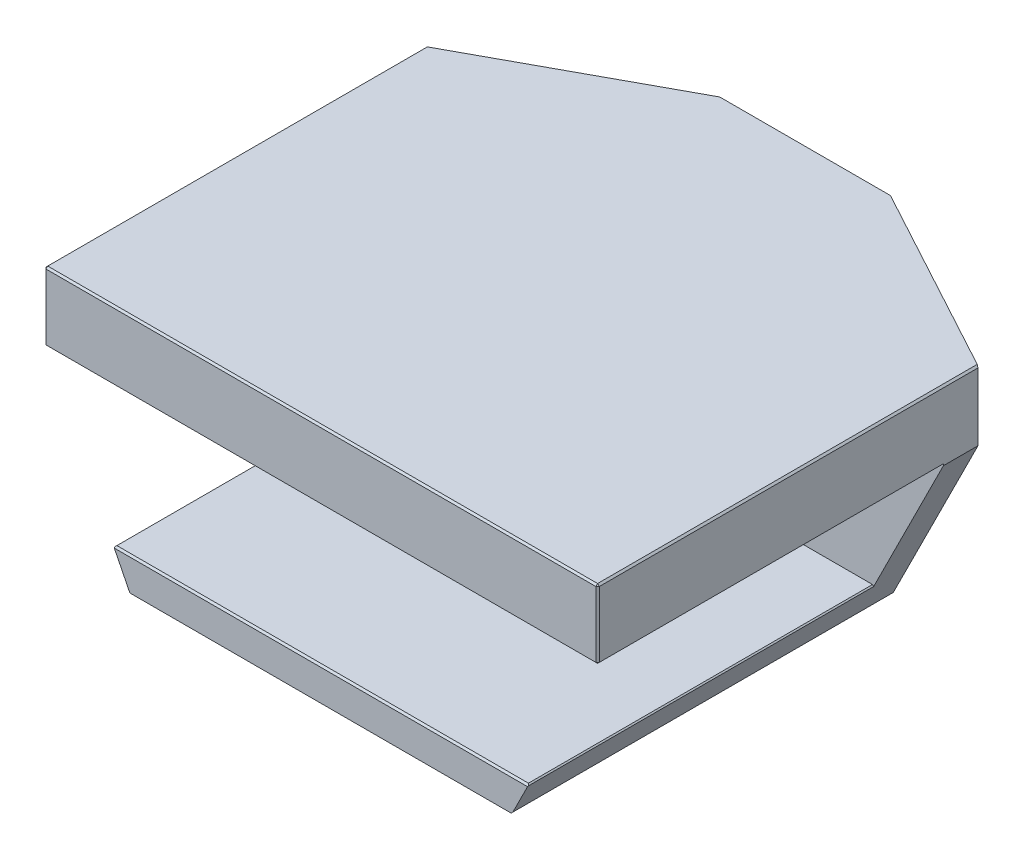
ISO-10303-21;
HEADER;
FILE_DESCRIPTION(('STEP AP214'),'2;1');
FILE_NAME('part.step','',(''),(''),'','','');
FILE_SCHEMA(('AUTOMOTIVE_DESIGN { 1 0 10303 214 1 1 1 1 }'));
ENDSEC;
DATA;
#1=APPLICATION_CONTEXT('core data for automotive mechanical design processes');
#2=APPLICATION_PROTOCOL_DEFINITION('international standard','automotive_design',2000,#1);
#3=PRODUCT_CONTEXT('',#1,'mechanical');
#4=PRODUCT('Part','Part','',(#3));
#5=PRODUCT_RELATED_PRODUCT_CATEGORY('part','',(#4));
#6=PRODUCT_DEFINITION_FORMATION('','',#4);
#7=PRODUCT_DEFINITION_CONTEXT('part definition',#1,'design');
#8=PRODUCT_DEFINITION('design','',#6,#7);
#9=PRODUCT_DEFINITION_SHAPE('','',#8);
#10=(LENGTH_UNIT() NAMED_UNIT(*) SI_UNIT(.MILLI.,.METRE.));
#11=(NAMED_UNIT(*) PLANE_ANGLE_UNIT() SI_UNIT($,.RADIAN.));
#12=(NAMED_UNIT(*) SI_UNIT($,.STERADIAN.) SOLID_ANGLE_UNIT());
#13=UNCERTAINTY_MEASURE_WITH_UNIT(LENGTH_MEASURE(1.E-05),#10,'distance_accuracy_value','');
#14=(GEOMETRIC_REPRESENTATION_CONTEXT(3) GLOBAL_UNCERTAINTY_ASSIGNED_CONTEXT((#13)) GLOBAL_UNIT_ASSIGNED_CONTEXT((#10,
#11,#12)) REPRESENTATION_CONTEXT('',''));
#15=CARTESIAN_POINT('',(0.,0.,0.));
#16=DIRECTION('',(0.,0.,1.));
#17=DIRECTION('',(1.,0.,0.));
#18=AXIS2_PLACEMENT_3D('',#15,#16,#17);
#19=CARTESIAN_POINT('',(0.,-20.,0.));
#20=DIRECTION('',(0.,-1.,0.));
#21=DIRECTION('',(0.,0.,-1.));
#22=AXIS2_PLACEMENT_3D('',#19,#20,#21);
#23=PLANE('',#22);
#24=DIRECTION('',(1.,0.,0.));
#25=VECTOR('',#24,1.);
#26=CARTESIAN_POINT('',(-183.314061184425,-20.,-120.430096120387));
#27=LINE('',#26,#25);
#28=CARTESIAN_POINT('',(-232.559077950902,-20.,-120.430096120387));
#29=VERTEX_POINT('',#28);
#30=CARTESIAN_POINT('',(-183.440922049098,-20.,-120.430096120387));
#31=VERTEX_POINT('',#30);
#32=EDGE_CURVE('E290',#29,#31,#27,.T.);
#33=ORIENTED_EDGE('',*,*,#32,.T.);
#34=DIRECTION('',(0.879037495013493,0.,0.47675264274087));
#35=VECTOR('',#34,1.);
#36=CARTESIAN_POINT('',(-128.23837632137,-20.,-90.4905773728802));
#37=LINE('',#36,#35);
#38=CARTESIAN_POINT('',(-129.048761884413,-20.,-90.930096120387));
#39=VERTEX_POINT('',#38);
#40=EDGE_CURVE('E292',#31,#39,#37,.T.);
#41=ORIENTED_EDGE('',*,*,#40,.T.);
#42=DIRECTION('',(-1.,0.,0.));
#43=VECTOR('',#42,1.);
#44=CARTESIAN_POINT('',(-128.,-20.,-90.930096120387));
#45=LINE('',#44,#43);
#46=CARTESIAN_POINT('',(-286.951238115588,-20.,-90.930096120387));
#47=VERTEX_POINT('',#46);
#48=EDGE_CURVE('E231',#39,#47,#45,.T.);
#49=ORIENTED_EDGE('',*,*,#48,.T.);
#50=DIRECTION('',(0.879037495013499,0.,-0.476752642740859));
#51=VECTOR('',#50,1.);
#52=CARTESIAN_POINT('',(-232.447562494204,-20.,-120.49057737288));
#53=LINE('',#52,#51);
#54=EDGE_CURVE('E288',#47,#29,#53,.T.);
#55=ORIENTED_EDGE('',*,*,#54,.T.);
#56=EDGE_LOOP('',(#33,#41,#49,#55));
#57=FACE_BOUND('',#56,.T.);
#58=ADVANCED_FACE('F17',(#57),#23,.T.);
#59=CARTESIAN_POINT('',(-288.,-20.,-120.930096120387));
#60=DIRECTION('',(0.,0.,1.));
#61=DIRECTION('',(1.,0.,0.));
#62=AXIS2_PLACEMENT_3D('',#59,#60,#61);
#63=PLANE('',#62);
#64=DIRECTION('',(0.,-1.,0.));
#65=VECTOR('',#64,1.);
#66=CARTESIAN_POINT('',(-183.314061184425,1.11022302462516E-13,-120.930096120387));
#67=LINE('',#66,#65);
#68=CARTESIAN_POINT('',(-183.314061184425,1.11022302462516E-13,-120.930096120387));
#69=VERTEX_POINT('',#68);
#70=CARTESIAN_POINT('',(-183.314061184425,-19.5,-120.930096120387));
#71=VERTEX_POINT('',#70);
#72=EDGE_CURVE('E483',#69,#71,#67,.T.);
#73=ORIENTED_EDGE('',*,*,#72,.T.);
#74=DIRECTION('',(-1.,0.,0.));
#75=VECTOR('',#74,1.);
#76=CARTESIAN_POINT('',(-232.685938815575,-19.5,-120.930096120387));
#77=LINE('',#76,#75);
#78=CARTESIAN_POINT('',(-232.685938815575,-19.5,-120.930096120387));
#79=VERTEX_POINT('',#78);
#80=EDGE_CURVE('E223',#71,#79,#77,.T.);
#81=ORIENTED_EDGE('',*,*,#80,.T.);
#82=DIRECTION('',(0.,-1.,0.));
#83=VECTOR('',#82,1.);
#84=CARTESIAN_POINT('',(-232.685938815575,1.11022302462516E-13,-120.930096120387));
#85=LINE('',#84,#83);
#86=CARTESIAN_POINT('',(-232.685938815575,1.11022302462516E-13,-120.930096120387));
#87=VERTEX_POINT('',#86);
#88=EDGE_CURVE('E208',#87,#79,#85,.T.);
#89=ORIENTED_EDGE('',*,*,#88,.F.);
#90=DIRECTION('',(1.,0.,0.));
#91=VECTOR('',#90,1.);
#92=CARTESIAN_POINT('',(-288.,1.11022302462516E-13,-120.930096120387));
#93=LINE('',#92,#91);
#94=EDGE_CURVE('E221',#87,#69,#93,.T.);
#95=ORIENTED_EDGE('',*,*,#94,.T.);
#96=EDGE_LOOP('',(#73,#81,#89,#95));
#97=FACE_BOUND('',#96,.T.);
#98=ADVANCED_FACE('F220',(#97),#63,.F.);
#99=CARTESIAN_POINT('',(-128.,-20.,-120.930096120387));
#100=DIRECTION('',(-1.,0.,0.));
#101=DIRECTION('',(0.,0.,1.));
#102=AXIS2_PLACEMENT_3D('',#99,#100,#101);
#103=PLANE('',#102);
#104=DIRECTION('',(0.,0.,-1.));
#105=VECTOR('',#104,1.);
#106=CARTESIAN_POINT('',(-128.,-19.5,-80.930096120387));
#107=LINE('',#106,#105);
#108=CARTESIAN_POINT('',(-128.,-19.5,18.569903879613));
#109=VERTEX_POINT('',#108);
#110=CARTESIAN_POINT('',(-128.,-19.5,-80.930096120387));
#111=VERTEX_POINT('',#110);
#112=EDGE_CURVE('E298',#109,#111,#107,.T.);
#113=ORIENTED_EDGE('',*,*,#112,.T.);
#114=DIRECTION('',(0.,-1.,0.));
#115=VECTOR('',#114,1.);
#116=CARTESIAN_POINT('',(-128.,-60.,-80.930096120387));
#117=LINE('',#116,#115);
#118=CARTESIAN_POINT('',(-128.,-20.,-80.930096120387));
#119=VERTEX_POINT('',#118);
#120=EDGE_CURVE('E301',#111,#119,#117,.T.);
#121=ORIENTED_EDGE('',*,*,#120,.T.);
#122=DIRECTION('',(0.,0.,-1.));
#123=VECTOR('',#122,1.);
#124=CARTESIAN_POINT('',(-128.,-20.,19.069903879613));
#125=LINE('',#124,#123);
#126=CARTESIAN_POINT('',(-128.,-20.,-90.930096120387));
#127=VERTEX_POINT('',#126);
#128=EDGE_CURVE('E476',#119,#127,#125,.T.);
#129=ORIENTED_EDGE('',*,*,#128,.T.);
#130=DIRECTION('',(0.,-1.,0.));
#131=VECTOR('',#130,1.);
#132=CARTESIAN_POINT('',(-128.,1.11022302462516E-13,-90.930096120387));
#133=LINE('',#132,#131);
#134=CARTESIAN_POINT('',(-128.,-19.5,-90.930096120387));
#135=VERTEX_POINT('',#134);
#136=EDGE_CURVE('E42',#135,#127,#133,.T.);
#137=ORIENTED_EDGE('',*,*,#136,.F.);
#138=CARTESIAN_POINT('',(-128.,-0.499999999999889,-90.930096120387));
#139=VERTEX_POINT('',#138);
#140=EDGE_CURVE('E492',#139,#135,#133,.T.);
#141=ORIENTED_EDGE('',*,*,#140,.F.);
#142=DIRECTION('',(0.,0.,1.));
#143=VECTOR('',#142,1.);
#144=CARTESIAN_POINT('',(-128.,-0.499999999999889,-120.930096120387));
#145=LINE('',#144,#143);
#146=CARTESIAN_POINT('',(-128.,-0.499999999999889,18.569903879613));
#147=VERTEX_POINT('',#146);
#148=EDGE_CURVE('E294',#139,#147,#145,.T.);
#149=ORIENTED_EDGE('',*,*,#148,.T.);
#150=DIRECTION('',(0.,-1.,0.));
#151=VECTOR('',#150,1.);
#152=CARTESIAN_POINT('',(-128.,-20.,18.569903879613));
#153=LINE('',#152,#151);
#154=EDGE_CURVE('E296',#147,#109,#153,.T.);
#155=ORIENTED_EDGE('',*,*,#154,.T.);
#156=EDGE_LOOP('',(#113,#121,#129,#137,#141,#149,#155));
#157=FACE_BOUND('',#156,.T.);
#158=ADVANCED_FACE('F410',(#157),#103,.F.);
#159=CARTESIAN_POINT('',(-128.,-20.,19.069903879613));
#160=DIRECTION('',(0.,0.,-1.));
#161=DIRECTION('',(-1.,0.,0.));
#162=AXIS2_PLACEMENT_3D('',#159,#160,#161);
#163=PLANE('',#162);
#164=DIRECTION('',(-1.,0.,0.));
#165=VECTOR('',#164,1.);
#166=CARTESIAN_POINT('',(-128.,-0.499999999999889,19.069903879613));
#167=LINE('',#166,#165);
#168=CARTESIAN_POINT('',(-128.5,-0.499999999999889,19.069903879613));
#169=VERTEX_POINT('',#168);
#170=CARTESIAN_POINT('',(-287.5,-0.499999999999889,19.069903879613));
#171=VERTEX_POINT('',#170);
#172=EDGE_CURVE('E321',#169,#171,#167,.T.);
#173=ORIENTED_EDGE('',*,*,#172,.T.);
#174=DIRECTION('',(0.,-1.,0.));
#175=VECTOR('',#174,1.);
#176=CARTESIAN_POINT('',(-287.5,-20.,19.069903879613));
#177=LINE('',#176,#175);
#178=CARTESIAN_POINT('',(-287.5,-19.5,19.069903879613));
#179=VERTEX_POINT('',#178);
#180=EDGE_CURVE('E327',#171,#179,#177,.T.);
#181=ORIENTED_EDGE('',*,*,#180,.T.);
#182=DIRECTION('',(1.,0.,0.));
#183=VECTOR('',#182,1.);
#184=CARTESIAN_POINT('',(-128.,-19.5,19.069903879613));
#185=LINE('',#184,#183);
#186=CARTESIAN_POINT('',(-128.5,-19.5,19.069903879613));
#187=VERTEX_POINT('',#186);
#188=EDGE_CURVE('E325',#179,#187,#185,.T.);
#189=ORIENTED_EDGE('',*,*,#188,.T.);
#190=DIRECTION('',(0.,1.,0.));
#191=VECTOR('',#190,1.);
#192=CARTESIAN_POINT('',(-128.5,-20.,19.069903879613));
#193=LINE('',#192,#191);
#194=EDGE_CURVE('E323',#187,#169,#193,.T.);
#195=ORIENTED_EDGE('',*,*,#194,.T.);
#196=EDGE_LOOP('',(#173,#181,#189,#195));
#197=FACE_BOUND('',#196,.T.);
#198=ADVANCED_FACE('F431',(#197),#163,.F.);
#199=CARTESIAN_POINT('',(-288.,-20.,-120.930096120387));
#200=DIRECTION('',(1.,0.,0.));
#201=DIRECTION('',(0.,0.,-1.));
#202=AXIS2_PLACEMENT_3D('',#199,#200,#201);
#203=PLANE('',#202);
#204=DIRECTION('',(0.,1.,0.));
#205=VECTOR('',#204,1.);
#206=CARTESIAN_POINT('',(-288.,-20.,18.569903879613));
#207=LINE('',#206,#205);
#208=CARTESIAN_POINT('',(-288.,-19.5,18.569903879613));
#209=VERTEX_POINT('',#208);
#210=CARTESIAN_POINT('',(-288.,-0.499999999999889,18.569903879613));
#211=VERTEX_POINT('',#210);
#212=EDGE_CURVE('E310',#209,#211,#207,.T.);
#213=ORIENTED_EDGE('',*,*,#212,.T.);
#214=DIRECTION('',(0.,0.,-1.));
#215=VECTOR('',#214,1.);
#216=CARTESIAN_POINT('',(-288.,-0.499999999999889,-120.930096120387));
#217=LINE('',#216,#215);
#218=CARTESIAN_POINT('',(-288.,-0.499999999999889,-90.9300961203877));
#219=VERTEX_POINT('',#218);
#220=EDGE_CURVE('E312',#211,#219,#217,.T.);
#221=ORIENTED_EDGE('',*,*,#220,.T.);
#222=DIRECTION('',(0.,-1.,0.));
#223=VECTOR('',#222,1.);
#224=CARTESIAN_POINT('',(-288.,1.11022302462516E-13,-90.9300961203877));
#225=LINE('',#224,#223);
#226=CARTESIAN_POINT('',(-288.,-19.5000000000007,-90.9300961203877));
#227=VERTEX_POINT('',#226);
#228=EDGE_CURVE('E489',#219,#227,#225,.T.);
#229=ORIENTED_EDGE('',*,*,#228,.T.);
#230=CARTESIAN_POINT('',(-288.,-20.,-90.9300961203877));
#231=VERTEX_POINT('',#230);
#232=EDGE_CURVE('E224',#227,#231,#225,.T.);
#233=ORIENTED_EDGE('',*,*,#232,.T.);
#234=DIRECTION('',(0.,0.,-1.));
#235=VECTOR('',#234,1.);
#236=CARTESIAN_POINT('',(-288.,-20.,19.069903879613));
#237=LINE('',#236,#235);
#238=CARTESIAN_POINT('',(-288.,-20.,-80.930096120387));
#239=VERTEX_POINT('',#238);
#240=EDGE_CURVE('E458',#239,#231,#237,.T.);
#241=ORIENTED_EDGE('',*,*,#240,.F.);
#242=DIRECTION('',(0.,1.,0.));
#243=VECTOR('',#242,1.);
#244=CARTESIAN_POINT('',(-288.,-60.,-80.930096120387));
#245=LINE('',#244,#243);
#246=CARTESIAN_POINT('',(-288.,-19.5,-80.930096120387));
#247=VERTEX_POINT('',#246);
#248=EDGE_CURVE('E34',#239,#247,#245,.T.);
#249=ORIENTED_EDGE('',*,*,#248,.T.);
#250=DIRECTION('',(0.,0.,1.));
#251=VECTOR('',#250,1.);
#252=CARTESIAN_POINT('',(-288.,-19.5,19.069903879613));
#253=LINE('',#252,#251);
#254=EDGE_CURVE('E307',#247,#209,#253,.T.);
#255=ORIENTED_EDGE('',*,*,#254,.T.);
#256=EDGE_LOOP('',(#213,#221,#229,#233,#241,#249,#255));
#257=FACE_BOUND('',#256,.T.);
#258=ADVANCED_FACE('F456',(#257),#203,.F.);
#259=DIRECTION('',(-1.,0.,0.));
#260=VECTOR('',#259,1.);
#261=CARTESIAN_POINT('',(-288.,-20.,18.569903879613));
#262=LINE('',#261,#260);
#263=CARTESIAN_POINT('',(-128.5,-20.,18.569903879613));
#264=VERTEX_POINT('',#263);
#265=CARTESIAN_POINT('',(-287.5,-20.,18.569903879613));
#266=VERTEX_POINT('',#265);
#267=EDGE_CURVE('E332',#264,#266,#262,.T.);
#268=ORIENTED_EDGE('',*,*,#267,.T.);
#269=DIRECTION('',(0.,0.,-1.));
#270=VECTOR('',#269,1.);
#271=CARTESIAN_POINT('',(-287.5,-20.,-80.930096120387));
#272=LINE('',#271,#270);
#273=CARTESIAN_POINT('',(-287.5,-20.,-80.930096120387));
#274=VERTEX_POINT('',#273);
#275=EDGE_CURVE('E334',#266,#274,#272,.T.);
#276=ORIENTED_EDGE('',*,*,#275,.T.);
#277=DIRECTION('',(-1.,0.,0.));
#278=VECTOR('',#277,1.);
#279=CARTESIAN_POINT('',(-128.,-20.,-80.930096120387));
#280=LINE('',#279,#278);
#281=CARTESIAN_POINT('',(-128.5,-20.,-80.930096120387));
#282=VERTEX_POINT('',#281);
#283=EDGE_CURVE('E236',#282,#274,#280,.T.);
#284=ORIENTED_EDGE('',*,*,#283,.F.);
#285=DIRECTION('',(0.,0.,1.));
#286=VECTOR('',#285,1.);
#287=CARTESIAN_POINT('',(-128.5,-20.,19.069903879613));
#288=LINE('',#287,#286);
#289=EDGE_CURVE('E330',#282,#264,#288,.T.);
#290=ORIENTED_EDGE('',*,*,#289,.T.);
#291=EDGE_LOOP('',(#268,#276,#284,#290));
#292=FACE_BOUND('',#291,.T.);
#293=ADVANCED_FACE('F447',(#292),#23,.T.);
#294=CARTESIAN_POINT('',(0.,1.11022302462516E-13,0.));
#295=DIRECTION('',(0.,-1.,0.));
#296=DIRECTION('',(0.,0.,-1.));
#297=AXIS2_PLACEMENT_3D('',#294,#295,#296);
#298=PLANE('',#297);
#299=DIRECTION('',(-0.879037495013499,0.,0.476752642740859));
#300=VECTOR('',#299,1.);
#301=CARTESIAN_POINT('',(-232.685938815575,1.11022302462516E-13,-120.930096120387));
#302=LINE('',#301,#300);
#303=CARTESIAN_POINT('',(-287.5,1.11022302462516E-13,-91.2012749070979));
#304=VERTEX_POINT('',#303);
#305=EDGE_CURVE('E204',#87,#304,#302,.T.);
#306=ORIENTED_EDGE('',*,*,#305,.T.);
#307=DIRECTION('',(0.,0.,1.));
#308=VECTOR('',#307,1.);
#309=CARTESIAN_POINT('',(-287.5,1.11022302462516E-13,0.));
#310=LINE('',#309,#308);
#311=CARTESIAN_POINT('',(-287.5,1.11022302462516E-13,18.569903879613));
#312=VERTEX_POINT('',#311);
#313=EDGE_CURVE('E319',#304,#312,#310,.T.);
#314=ORIENTED_EDGE('',*,*,#313,.T.);
#315=DIRECTION('',(1.,0.,0.));
#316=VECTOR('',#315,1.);
#317=CARTESIAN_POINT('',(0.,1.11022302462516E-13,18.569903879613));
#318=LINE('',#317,#316);
#319=CARTESIAN_POINT('',(-128.5,1.11022302462516E-13,18.569903879613));
#320=VERTEX_POINT('',#319);
#321=EDGE_CURVE('E315',#312,#320,#318,.T.);
#322=ORIENTED_EDGE('',*,*,#321,.T.);
#323=DIRECTION('',(0.,0.,-1.));
#324=VECTOR('',#323,1.);
#325=CARTESIAN_POINT('',(-128.5,1.11022302462516E-13,0.));
#326=LINE('',#325,#324);
#327=CARTESIAN_POINT('',(-128.5,1.11022302462516E-13,-91.2012749070971));
#328=VERTEX_POINT('',#327);
#329=EDGE_CURVE('E317',#320,#328,#326,.T.);
#330=ORIENTED_EDGE('',*,*,#329,.T.);
#331=DIRECTION('',(-0.879037495013493,0.,-0.476752642740869));
#332=VECTOR('',#331,1.);
#333=CARTESIAN_POINT('',(-183.314061184425,1.11022302462516E-13,-120.930096120387));
#334=LINE('',#333,#332);
#335=EDGE_CURVE('E228',#328,#69,#334,.T.);
#336=ORIENTED_EDGE('',*,*,#335,.T.);
#337=ORIENTED_EDGE('',*,*,#94,.F.);
#338=EDGE_LOOP('',(#306,#314,#322,#330,#336,#337));
#339=FACE_BOUND('',#338,.T.);
#340=ADVANCED_FACE('F226',(#339),#298,.F.);
#341=CARTESIAN_POINT('',(-128.,-20.,-90.930096120387));
#342=DIRECTION('',(0.,0.,-1.));
#343=DIRECTION('',(-1.,0.,0.));
#344=AXIS2_PLACEMENT_3D('',#341,#342,#343);
#345=PLANE('',#344);
#346=DIRECTION('',(-0.707106781186548,-0.707106781186548,0.));
#347=VECTOR('',#346,1.);
#348=CARTESIAN_POINT('',(-115.75,-32.25,-90.930096120387));
#349=LINE('',#348,#347);
#350=CARTESIAN_POINT('',(-152.5,-69.,-90.930096120387));
#351=VERTEX_POINT('',#350);
#352=CARTESIAN_POINT('',(-153.,-69.5,-90.930096120387));
#353=VERTEX_POINT('',#352);
#354=EDGE_CURVE('E279',#351,#353,#349,.T.);
#355=ORIENTED_EDGE('',*,*,#354,.T.);
#356=DIRECTION('',(-1.,0.,0.));
#357=VECTOR('',#356,1.);
#358=CARTESIAN_POINT('',(-128.,-69.5,-90.930096120387));
#359=LINE('',#358,#357);
#360=CARTESIAN_POINT('',(-263.25,-69.5,-90.930096120387));
#361=VERTEX_POINT('',#360);
#362=EDGE_CURVE('E281',#353,#361,#359,.T.);
#363=ORIENTED_EDGE('',*,*,#362,.T.);
#364=DIRECTION('',(0.447213595499958,-0.894427190999916,0.));
#365=VECTOR('',#364,1.);
#366=CARTESIAN_POINT('',(-263.,-70.,-90.930096120387));
#367=LINE('',#366,#365);
#368=EDGE_CURVE('E478',#231,#361,#367,.T.);
#369=ORIENTED_EDGE('',*,*,#368,.F.);
#370=ORIENTED_EDGE('',*,*,#232,.F.);
#371=DIRECTION('',(0.902663448259857,-0.430347184463457,0.));
#372=VECTOR('',#371,1.);
#373=CARTESIAN_POINT('',(-242.930030993052,-40.9872268323117,-90.930096120387));
#374=LINE('',#373,#372);
#375=EDGE_CURVE('E343',#227,#47,#374,.T.);
#376=ORIENTED_EDGE('',*,*,#375,.T.);
#377=ORIENTED_EDGE('',*,*,#48,.F.);
#378=DIRECTION('',(0.902663448259846,0.430347184463479,0.));
#379=VECTOR('',#378,1.);
#380=CARTESIAN_POINT('',(-173.069969006947,-40.9872268323118,-90.930096120387));
#381=LINE('',#380,#379);
#382=EDGE_CURVE('E341',#39,#135,#381,.T.);
#383=ORIENTED_EDGE('',*,*,#382,.T.);
#384=ORIENTED_EDGE('',*,*,#136,.T.);
#385=DIRECTION('',(0.447213595499959,0.894427190999916,0.));
#386=VECTOR('',#385,1.);
#387=CARTESIAN_POINT('',(-153.,-70.,-90.930096120387));
#388=LINE('',#387,#386);
#389=EDGE_CURVE('E480',#351,#127,#388,.T.);
#390=ORIENTED_EDGE('',*,*,#389,.F.);
#391=EDGE_LOOP('',(#355,#363,#369,#370,#376,#377,#383,#384,#390));
#392=FACE_BOUND('',#391,.T.);
#393=ADVANCED_FACE('F501',(#392),#345,.T.);
#394=CARTESIAN_POINT('',(-128.,-60.,-80.930096120387));
#395=DIRECTION('',(0.,0.,1.));
#396=DIRECTION('',(1.,0.,0.));
#397=AXIS2_PLACEMENT_3D('',#394,#395,#396);
#398=PLANE('',#397);
#399=DIRECTION('',(-0.447213595499958,0.894427190999916,0.));
#400=VECTOR('',#399,1.);
#401=CARTESIAN_POINT('',(-240.,-116.,-80.930096120387));
#402=LINE('',#401,#400);
#403=CARTESIAN_POINT('',(-267.833333333334,-60.3333333333332,-80.930096120387));
#404=VERTEX_POINT('',#403);
#405=EDGE_CURVE('E467',#404,#239,#402,.T.);
#406=ORIENTED_EDGE('',*,*,#405,.F.);
#407=DIRECTION('',(0.707106781186577,0.707106781186518,0.));
#408=VECTOR('',#407,1.);
#409=CARTESIAN_POINT('',(-267.833333333334,-60.3333333333332,-80.930096120387));
#410=LINE('',#409,#408);
#411=CARTESIAN_POINT('',(-267.5,-60.,-80.930096120387));
#412=VERTEX_POINT('',#411);
#413=EDGE_CURVE('E339',#404,#412,#410,.T.);
#414=ORIENTED_EDGE('',*,*,#413,.T.);
#415=DIRECTION('',(-1.,0.,0.));
#416=VECTOR('',#415,1.);
#417=CARTESIAN_POINT('',(-128.,-60.,-80.930096120387));
#418=LINE('',#417,#416);
#419=CARTESIAN_POINT('',(-148.5,-60.,-80.930096120387));
#420=VERTEX_POINT('',#419);
#421=EDGE_CURVE('E239',#420,#412,#418,.T.);
#422=ORIENTED_EDGE('',*,*,#421,.F.);
#423=DIRECTION('',(0.707106781186548,-0.707106781186548,0.));
#424=VECTOR('',#423,1.);
#425=CARTESIAN_POINT('',(-148.166666666667,-60.3333333333332,-80.930096120387));
#426=LINE('',#425,#424);
#427=CARTESIAN_POINT('',(-148.166666666667,-60.3333333333332,-80.930096120387));
#428=VERTEX_POINT('',#427);
#429=EDGE_CURVE('E336',#420,#428,#426,.T.);
#430=ORIENTED_EDGE('',*,*,#429,.T.);
#431=DIRECTION('',(-0.447213595499959,-0.894427190999916,0.));
#432=VECTOR('',#431,1.);
#433=CARTESIAN_POINT('',(-144.,-52.,-80.930096120387));
#434=LINE('',#433,#432);
#435=EDGE_CURVE('E464',#119,#428,#434,.T.);
#436=ORIENTED_EDGE('',*,*,#435,.F.);
#437=ORIENTED_EDGE('',*,*,#120,.F.);
#438=DIRECTION('',(-0.707106781186528,-0.707106781186567,0.));
#439=VECTOR('',#438,1.);
#440=CARTESIAN_POINT('',(-128.5,-20.,-80.930096120387));
#441=LINE('',#440,#439);
#442=EDGE_CURVE('E11',#111,#282,#441,.T.);
#443=ORIENTED_EDGE('',*,*,#442,.T.);
#444=ORIENTED_EDGE('',*,*,#283,.T.);
#445=DIRECTION('',(-0.707106781186528,0.707106781186567,0.));
#446=VECTOR('',#445,1.);
#447=CARTESIAN_POINT('',(-287.5,-20.,-80.930096120387));
#448=LINE('',#447,#446);
#449=EDGE_CURVE('E26',#274,#247,#448,.T.);
#450=ORIENTED_EDGE('',*,*,#449,.T.);
#451=ORIENTED_EDGE('',*,*,#248,.F.);
#452=EDGE_LOOP('',(#406,#414,#422,#430,#436,#437,#443,#444,#450,#451));
#453=FACE_BOUND('',#452,.T.);
#454=ADVANCED_FACE('F454',(#453),#398,.T.);
#455=CARTESIAN_POINT('',(-128.,-60.,19.069903879613));
#456=DIRECTION('',(0.,1.,0.));
#457=DIRECTION('',(0.,0.,1.));
#458=AXIS2_PLACEMENT_3D('',#455,#456,#457);
#459=PLANE('',#458);
#460=DIRECTION('',(1.,0.,0.));
#461=VECTOR('',#460,1.);
#462=CARTESIAN_POINT('',(-128.,-60.,18.5699038796131));
#463=LINE('',#462,#461);
#464=CARTESIAN_POINT('',(-267.5,-60.,18.5699038796131));
#465=VERTEX_POINT('',#464);
#466=CARTESIAN_POINT('',(-148.5,-60.,18.5699038796131));
#467=VERTEX_POINT('',#466);
#468=EDGE_CURVE('E248',#465,#467,#463,.T.);
#469=ORIENTED_EDGE('',*,*,#468,.T.);
#470=DIRECTION('',(0.,0.,-1.));
#471=VECTOR('',#470,1.);
#472=CARTESIAN_POINT('',(-148.5,-60.,-80.930096120387));
#473=LINE('',#472,#471);
#474=EDGE_CURVE('E250',#467,#420,#473,.T.);
#475=ORIENTED_EDGE('',*,*,#474,.T.);
#476=ORIENTED_EDGE('',*,*,#421,.T.);
#477=DIRECTION('',(0.,0.,1.));
#478=VECTOR('',#477,1.);
#479=CARTESIAN_POINT('',(-267.5,-60.,19.069903879613));
#480=LINE('',#479,#478);
#481=EDGE_CURVE('E246',#412,#465,#480,.T.);
#482=ORIENTED_EDGE('',*,*,#481,.T.);
#483=EDGE_LOOP('',(#469,#475,#476,#482));
#484=FACE_BOUND('',#483,.T.);
#485=ADVANCED_FACE('F559',(#484),#459,.T.);
#486=CARTESIAN_POINT('',(-128.,-70.,19.069903879613));
#487=DIRECTION('',(0.,0.,1.));
#488=DIRECTION('',(1.,0.,0.));
#489=AXIS2_PLACEMENT_3D('',#486,#487,#488);
#490=PLANE('',#489);
#491=DIRECTION('',(0.447213595499959,0.894427190999916,0.));
#492=VECTOR('',#491,1.);
#493=CARTESIAN_POINT('',(-153.,-70.,19.069903879613));
#494=LINE('',#493,#492);
#495=CARTESIAN_POINT('',(-152.5,-69.,19.069903879613));
#496=VERTEX_POINT('',#495);
#497=CARTESIAN_POINT('',(-148.25,-60.5,19.069903879613));
#498=VERTEX_POINT('',#497);
#499=EDGE_CURVE('E479',#496,#498,#494,.T.);
#500=ORIENTED_EDGE('',*,*,#499,.T.);
#501=DIRECTION('',(-1.,0.,0.));
#502=VECTOR('',#501,1.);
#503=CARTESIAN_POINT('',(-128.,-60.5,19.069903879613));
#504=LINE('',#503,#502);
#505=CARTESIAN_POINT('',(-267.75,-60.5,19.069903879613));
#506=VERTEX_POINT('',#505);
#507=EDGE_CURVE('E257',#498,#506,#504,.T.);
#508=ORIENTED_EDGE('',*,*,#507,.T.);
#509=DIRECTION('',(0.447213595499958,-0.894427190999916,0.));
#510=VECTOR('',#509,1.);
#511=CARTESIAN_POINT('',(-263.,-70.,19.069903879613));
#512=LINE('',#511,#510);
#513=CARTESIAN_POINT('',(-263.25,-69.5,19.069903879613));
#514=VERTEX_POINT('',#513);
#515=EDGE_CURVE('E465',#506,#514,#512,.T.);
#516=ORIENTED_EDGE('',*,*,#515,.T.);
#517=DIRECTION('',(1.,0.,0.));
#518=VECTOR('',#517,1.);
#519=CARTESIAN_POINT('',(-128.,-69.5,19.069903879613));
#520=LINE('',#519,#518);
#521=CARTESIAN_POINT('',(-153.,-69.5,19.069903879613));
#522=VERTEX_POINT('',#521);
#523=EDGE_CURVE('E254',#514,#522,#520,.T.);
#524=ORIENTED_EDGE('',*,*,#523,.T.);
#525=DIRECTION('',(0.707106781186548,0.707106781186548,0.));
#526=VECTOR('',#525,1.);
#527=CARTESIAN_POINT('',(-140.75,-57.25,19.069903879613));
#528=LINE('',#527,#526);
#529=EDGE_CURVE('E252',#522,#496,#528,.T.);
#530=ORIENTED_EDGE('',*,*,#529,.T.);
#531=EDGE_LOOP('',(#500,#508,#516,#524,#530));
#532=FACE_BOUND('',#531,.T.);
#533=ADVANCED_FACE('F545',(#532),#490,.T.);
#534=CARTESIAN_POINT('',(-128.,-70.,-90.930096120387));
#535=DIRECTION('',(0.,-1.,0.));
#536=DIRECTION('',(0.,0.,-1.));
#537=AXIS2_PLACEMENT_3D('',#534,#535,#536);
#538=PLANE('',#537);
#539=DIRECTION('',(0.,0.,1.));
#540=VECTOR('',#539,1.);
#541=CARTESIAN_POINT('',(-153.5,-70.,19.069903879613));
#542=LINE('',#541,#540);
#543=CARTESIAN_POINT('',(-153.5,-70.,-90.430096120387));
#544=VERTEX_POINT('',#543);
#545=CARTESIAN_POINT('',(-153.5,-70.,18.569903879613));
#546=VERTEX_POINT('',#545);
#547=EDGE_CURVE('E270',#544,#546,#542,.T.);
#548=ORIENTED_EDGE('',*,*,#547,.T.);
#549=DIRECTION('',(-1.,0.,0.));
#550=VECTOR('',#549,1.);
#551=CARTESIAN_POINT('',(-128.,-70.,18.569903879613));
#552=LINE('',#551,#550);
#553=CARTESIAN_POINT('',(-261.88196601125,-70.,18.569903879613));
#554=VERTEX_POINT('',#553);
#555=EDGE_CURVE('E276',#546,#554,#552,.T.);
#556=ORIENTED_EDGE('',*,*,#555,.T.);
#557=DIRECTION('',(0.,0.,-1.));
#558=VECTOR('',#557,1.);
#559=CARTESIAN_POINT('',(-261.88196601125,-70.,-90.930096120387));
#560=LINE('',#559,#558);
#561=CARTESIAN_POINT('',(-261.88196601125,-70.,-90.430096120387));
#562=VERTEX_POINT('',#561);
#563=EDGE_CURVE('E274',#554,#562,#560,.T.);
#564=ORIENTED_EDGE('',*,*,#563,.T.);
#565=DIRECTION('',(1.,0.,0.));
#566=VECTOR('',#565,1.);
#567=CARTESIAN_POINT('',(-128.,-70.,-90.430096120387));
#568=LINE('',#567,#566);
#569=EDGE_CURVE('E272',#562,#544,#568,.T.);
#570=ORIENTED_EDGE('',*,*,#569,.T.);
#571=EDGE_LOOP('',(#548,#556,#564,#570));
#572=FACE_BOUND('',#571,.T.);
#573=ADVANCED_FACE('F659',(#572),#538,.T.);
#574=CARTESIAN_POINT('',(-153.,-70.,19.069903879613));
#575=DIRECTION('',(-0.894427190999916,0.447213595499959,0.));
#576=DIRECTION('',(-0.447213595499959,-0.894427190999916,0.));
#577=AXIS2_PLACEMENT_3D('',#574,#575,#576);
#578=PLANE('',#577);
#579=ORIENTED_EDGE('',*,*,#435,.T.);
#580=DIRECTION('',(0.,0.,1.));
#581=VECTOR('',#580,1.);
#582=CARTESIAN_POINT('',(-148.166666666667,-60.3333333333332,19.069903879613));
#583=LINE('',#582,#581);
#584=CARTESIAN_POINT('',(-148.166666666667,-60.3333333333332,18.9032372129464));
#585=VERTEX_POINT('',#584);
#586=EDGE_CURVE('E243',#428,#585,#583,.T.);
#587=ORIENTED_EDGE('',*,*,#586,.T.);
#588=DIRECTION('',(0.333333333333334,0.666666666666667,-0.666666666666667));
#589=VECTOR('',#588,1.);
#590=CARTESIAN_POINT('',(-146.,-56.,14.569903879613));
#591=LINE('',#590,#589);
#592=EDGE_CURVE('E233',#585,#498,#591,.F.);
#593=ORIENTED_EDGE('',*,*,#592,.T.);
#594=ORIENTED_EDGE('',*,*,#499,.F.);
#595=DIRECTION('',(0.,0.,-1.));
#596=VECTOR('',#595,1.);
#597=CARTESIAN_POINT('',(-152.5,-69.,-90.930096120387));
#598=LINE('',#597,#596);
#599=EDGE_CURVE('E230',#496,#351,#598,.T.);
#600=ORIENTED_EDGE('',*,*,#599,.T.);
#601=ORIENTED_EDGE('',*,*,#389,.T.);
#602=ORIENTED_EDGE('',*,*,#128,.F.);
#603=EDGE_LOOP('',(#579,#587,#593,#594,#600,#601,#602));
#604=FACE_BOUND('',#603,.T.);
#605=ADVANCED_FACE('F517',(#604),#578,.F.);
#606=CARTESIAN_POINT('',(-263.,-70.,19.069903879613));
#607=DIRECTION('',(0.894427190999916,0.447213595499958,0.));
#608=DIRECTION('',(-0.447213595499958,0.894427190999916,0.));
#609=AXIS2_PLACEMENT_3D('',#606,#607,#608);
#610=PLANE('',#609);
#611=ORIENTED_EDGE('',*,*,#515,.F.);
#612=DIRECTION('',(0.333333333333334,-0.666666666666667,0.666666666666667));
#613=VECTOR('',#612,1.);
#614=CARTESIAN_POINT('',(-252.222222222222,-91.5555555555554,50.1254594351686));
#615=LINE('',#614,#613);
#616=CARTESIAN_POINT('',(-267.833333333334,-60.3333333333332,18.9032372129464));
#617=VERTEX_POINT('',#616);
#618=EDGE_CURVE('E268',#506,#617,#615,.F.);
#619=ORIENTED_EDGE('',*,*,#618,.T.);
#620=DIRECTION('',(0.,0.,-1.));
#621=VECTOR('',#620,1.);
#622=CARTESIAN_POINT('',(-267.833333333334,-60.3333333333332,-80.930096120387));
#623=LINE('',#622,#621);
#624=EDGE_CURVE('E265',#617,#404,#623,.T.);
#625=ORIENTED_EDGE('',*,*,#624,.T.);
#626=ORIENTED_EDGE('',*,*,#405,.T.);
#627=ORIENTED_EDGE('',*,*,#240,.T.);
#628=ORIENTED_EDGE('',*,*,#368,.T.);
#629=DIRECTION('',(-0.333333333333325,0.66666666666665,-0.666666666666687));
#630=VECTOR('',#629,1.);
#631=CARTESIAN_POINT('',(-248.222222222223,-99.555555555554,-60.8745405648313));
#632=LINE('',#631,#630);
#633=CARTESIAN_POINT('',(-263.22360679775,-69.5527864044999,-90.877309715887));
#634=VERTEX_POINT('',#633);
#635=EDGE_CURVE('E259',#361,#634,#632,.F.);
#636=ORIENTED_EDGE('',*,*,#635,.T.);
#637=DIRECTION('',(0.,0.,1.));
#638=VECTOR('',#637,1.);
#639=CARTESIAN_POINT('',(-263.22360679775,-69.5527864044999,19.069903879613));
#640=LINE('',#639,#638);
#641=CARTESIAN_POINT('',(-263.22360679775,-69.5527864044999,19.0171174751131));
#642=VERTEX_POINT('',#641);
#643=EDGE_CURVE('E261',#634,#642,#640,.T.);
#644=ORIENTED_EDGE('',*,*,#643,.T.);
#645=DIRECTION('',(0.333333333333334,-0.666666666666667,-0.666666666666667));
#646=VECTOR('',#645,1.);
#647=CARTESIAN_POINT('',(-248.,-100.,-11.430096120387));
#648=LINE('',#647,#646);
#649=EDGE_CURVE('E263',#642,#514,#648,.F.);
#650=ORIENTED_EDGE('',*,*,#649,.T.);
#651=EDGE_LOOP('',(#611,#619,#625,#626,#627,#628,#636,#644,#650));
#652=FACE_BOUND('',#651,.T.);
#653=ADVANCED_FACE('F469',(#652),#610,.F.);
#654=CARTESIAN_POINT('',(-232.685938815575,1.11022302462516E-13,-120.930096120387));
#655=DIRECTION('',(0.476752642740859,0.,0.879037495013499));
#656=DIRECTION('',(0.879037495013499,0.,-0.476752642740859));
#657=AXIS2_PLACEMENT_3D('',#654,#655,#656);
#658=PLANE('',#657);
#659=ORIENTED_EDGE('',*,*,#88,.T.);
#660=DIRECTION('',(-0.879037495013499,0.,0.476752642740859));
#661=VECTOR('',#660,1.);
#662=CARTESIAN_POINT('',(-288.,-19.5,-90.9300961203877));
#663=LINE('',#662,#661);
#664=EDGE_CURVE('E305',#79,#227,#663,.T.);
#665=ORIENTED_EDGE('',*,*,#664,.T.);
#666=ORIENTED_EDGE('',*,*,#228,.F.);
#667=DIRECTION('',(-0.660220386383179,-0.660220386383179,0.358075526681302));
#668=VECTOR('',#667,1.);
#669=CARTESIAN_POINT('',(-280.907737122603,6.59226287739661,-94.7766386046305));
#670=LINE('',#669,#668);
#671=EDGE_CURVE('E211',#219,#304,#670,.F.);
#672=ORIENTED_EDGE('',*,*,#671,.T.);
#673=ORIENTED_EDGE('',*,*,#305,.F.);
#674=EDGE_LOOP('',(#659,#665,#666,#672,#673));
#675=FACE_BOUND('',#674,.T.);
#676=ADVANCED_FACE('F206',(#675),#658,.F.);
#677=CARTESIAN_POINT('',(-183.314061184425,1.11022302462516E-13,-120.930096120387));
#678=DIRECTION('',(-0.47675264274087,0.,0.879037495013493));
#679=DIRECTION('',(0.879037495013493,0.,0.47675264274087));
#680=AXIS2_PLACEMENT_3D('',#677,#678,#679);
#681=PLANE('',#680);
#682=ORIENTED_EDGE('',*,*,#140,.T.);
#683=DIRECTION('',(-0.879037495013493,0.,-0.47675264274087));
#684=VECTOR('',#683,1.);
#685=CARTESIAN_POINT('',(-183.314061184425,-19.5,-120.930096120387));
#686=LINE('',#685,#684);
#687=EDGE_CURVE('E285',#135,#71,#686,.T.);
#688=ORIENTED_EDGE('',*,*,#687,.T.);
#689=ORIENTED_EDGE('',*,*,#72,.F.);
#690=ORIENTED_EDGE('',*,*,#335,.F.);
#691=DIRECTION('',(-0.660220386383192,0.660220386383156,-0.35807552668132));
#692=VECTOR('',#691,1.);
#693=CARTESIAN_POINT('',(-135.092262877397,6.5922628773969,-94.7766386046301));
#694=LINE('',#693,#692);
#695=EDGE_CURVE('E283',#328,#139,#694,.F.);
#696=ORIENTED_EDGE('',*,*,#695,.T.);
#697=EDGE_LOOP('',(#682,#688,#689,#690,#696));
#698=FACE_BOUND('',#697,.T.);
#699=ADVANCED_FACE('F514',(#698),#681,.F.);
#700=CARTESIAN_POINT('',(-267.833333333334,-60.3333333333332,19.069903879613));
#701=DIRECTION('',(-0.707106781186518,0.707106781186577,0.));
#702=DIRECTION('',(0.,0.,1.));
#703=AXIS2_PLACEMENT_3D('',#700,#701,#702);
#704=PLANE('',#703);
#705=ORIENTED_EDGE('',*,*,#413,.F.);
#706=ORIENTED_EDGE('',*,*,#624,.F.);
#707=DIRECTION('',(-0.577350269189658,-0.57735026918961,0.57735026918961));
#708=VECTOR('',#707,1.);
#709=CARTESIAN_POINT('',(-267.888888888889,-60.3888888888888,18.9587927685019));
#710=LINE('',#709,#708);
#711=EDGE_CURVE('E215',#465,#617,#710,.T.);
#712=ORIENTED_EDGE('',*,*,#711,.F.);
#713=ORIENTED_EDGE('',*,*,#481,.F.);
#714=EDGE_LOOP('',(#705,#706,#712,#713));
#715=FACE_BOUND('',#714,.T.);
#716=ADVANCED_FACE('F554',(#715),#704,.T.);
#717=CARTESIAN_POINT('',(-128.,-60.5,19.069903879613));
#718=DIRECTION('',(0.,-0.707106781186548,-0.707106781186548));
#719=DIRECTION('',(-1.,0.,0.));
#720=AXIS2_PLACEMENT_3D('',#717,#718,#719);
#721=PLANE('',#720);
#722=ORIENTED_EDGE('',*,*,#507,.F.);
#723=ORIENTED_EDGE('',*,*,#592,.F.);
#724=DIRECTION('',(0.577350269189626,-0.577350269189626,0.577350269189626));
#725=VECTOR('',#724,1.);
#726=CARTESIAN_POINT('',(-141.333333333333,-67.1666666666665,25.7365705462797));
#727=LINE('',#726,#725);
#728=EDGE_CURVE('E346',#467,#585,#727,.T.);
#729=ORIENTED_EDGE('',*,*,#728,.F.);
#730=ORIENTED_EDGE('',*,*,#468,.F.);
#731=ORIENTED_EDGE('',*,*,#711,.T.);
#732=ORIENTED_EDGE('',*,*,#618,.F.);
#733=EDGE_LOOP('',(#722,#723,#729,#730,#731,#732));
#734=FACE_BOUND('',#733,.T.);
#735=ADVANCED_FACE('F549',(#734),#721,.F.);
#736=CARTESIAN_POINT('',(-148.166666666667,-60.3333333333332,19.069903879613));
#737=DIRECTION('',(0.707106781186548,0.707106781186548,0.));
#738=DIRECTION('',(0.,0.,-1.));
#739=AXIS2_PLACEMENT_3D('',#736,#737,#738);
#740=PLANE('',#739);
#741=ORIENTED_EDGE('',*,*,#429,.F.);
#742=ORIENTED_EDGE('',*,*,#474,.F.);
#743=ORIENTED_EDGE('',*,*,#728,.T.);
#744=ORIENTED_EDGE('',*,*,#586,.F.);
#745=EDGE_LOOP('',(#741,#742,#743,#744));
#746=FACE_BOUND('',#745,.T.);
#747=ADVANCED_FACE('F562',(#746),#740,.T.);
#748=CARTESIAN_POINT('',(-128.,-69.5,-90.930096120387));
#749=DIRECTION('',(0.,0.707106781186567,0.707106781186528));
#750=DIRECTION('',(-1.,0.,0.));
#751=AXIS2_PLACEMENT_3D('',#748,#749,#750);
#752=PLANE('',#751);
#753=ORIENTED_EDGE('',*,*,#635,.F.);
#754=ORIENTED_EDGE('',*,*,#362,.F.);
#755=DIRECTION('',(-0.577350269189615,-0.577350269189615,0.577350269189647));
#756=VECTOR('',#755,1.);
#757=CARTESIAN_POINT('',(-189.333333333334,-105.833333333334,-54.596762787051));
#758=LINE('',#757,#756);
#759=EDGE_CURVE('E348',#544,#353,#758,.F.);
#760=ORIENTED_EDGE('',*,*,#759,.F.);
#761=ORIENTED_EDGE('',*,*,#569,.F.);
#762=DIRECTION('',(0.904534033733279,-0.301511344577773,0.301511344577789));
#763=VECTOR('',#762,1.);
#764=CARTESIAN_POINT('',(-152.614902911139,-106.422354366705,-54.0077417536799));
#765=LINE('',#764,#763);
#766=EDGE_CURVE('E356',#634,#562,#765,.T.);
#767=ORIENTED_EDGE('',*,*,#766,.F.);
#768=EDGE_LOOP('',(#753,#754,#760,#761,#767));
#769=FACE_BOUND('',#768,.T.);
#770=ADVANCED_FACE('F531',(#769),#752,.F.);
#771=CARTESIAN_POINT('',(-152.5,-69.,19.069903879613));
#772=DIRECTION('',(0.707106781186548,-0.707106781186548,0.));
#773=DIRECTION('',(0.,0.,1.));
#774=AXIS2_PLACEMENT_3D('',#771,#772,#773);
#775=PLANE('',#774);
#776=ORIENTED_EDGE('',*,*,#599,.F.);
#777=ORIENTED_EDGE('',*,*,#529,.F.);
#778=DIRECTION('',(0.577350269189626,0.577350269189626,0.577350269189626));
#779=VECTOR('',#778,1.);
#780=CARTESIAN_POINT('',(-152.666666666667,-69.1666666666665,19.4032372129464));
#781=LINE('',#780,#779);
#782=EDGE_CURVE('E353',#546,#522,#781,.T.);
#783=ORIENTED_EDGE('',*,*,#782,.F.);
#784=ORIENTED_EDGE('',*,*,#547,.F.);
#785=ORIENTED_EDGE('',*,*,#759,.T.);
#786=ORIENTED_EDGE('',*,*,#354,.F.);
#787=EDGE_LOOP('',(#776,#777,#783,#784,#785,#786));
#788=FACE_BOUND('',#787,.T.);
#789=ADVANCED_FACE('F523',(#788),#775,.T.);
#790=CARTESIAN_POINT('',(-261.88196601125,-70.,-90.930096120387));
#791=DIRECTION('',(-0.31622776601685,-0.94868329805051,0.));
#792=DIRECTION('',(0.,0.,1.));
#793=AXIS2_PLACEMENT_3D('',#790,#791,#792);
#794=PLANE('',#793);
#795=ORIENTED_EDGE('',*,*,#766,.T.);
#796=ORIENTED_EDGE('',*,*,#563,.F.);
#797=DIRECTION('',(0.904534033733284,-0.301511344577774,-0.301511344577774));
#798=VECTOR('',#797,1.);
#799=CARTESIAN_POINT('',(-232.018329647613,-79.954545454546,8.61535842506689));
#800=LINE('',#799,#798);
#801=EDGE_CURVE('E351',#642,#554,#800,.T.);
#802=ORIENTED_EDGE('',*,*,#801,.F.);
#803=ORIENTED_EDGE('',*,*,#643,.F.);
#804=EDGE_LOOP('',(#795,#796,#802,#803));
#805=FACE_BOUND('',#804,.T.);
#806=ADVANCED_FACE('F537',(#805),#794,.T.);
#807=CARTESIAN_POINT('',(-128.,-70.,18.569903879613));
#808=DIRECTION('',(0.,0.707106781186548,-0.707106781186548));
#809=DIRECTION('',(-1.,0.,0.));
#810=AXIS2_PLACEMENT_3D('',#807,#808,#809);
#811=PLANE('',#810);
#812=ORIENTED_EDGE('',*,*,#782,.T.);
#813=ORIENTED_EDGE('',*,*,#523,.F.);
#814=ORIENTED_EDGE('',*,*,#649,.F.);
#815=ORIENTED_EDGE('',*,*,#801,.T.);
#816=ORIENTED_EDGE('',*,*,#555,.F.);
#817=EDGE_LOOP('',(#812,#813,#814,#815,#816));
#818=FACE_BOUND('',#817,.T.);
#819=ADVANCED_FACE('F542',(#818),#811,.F.);
#820=CARTESIAN_POINT('',(-232.685938815575,-19.5,-120.930096120387));
#821=DIRECTION('',(-0.337115026630667,-0.707106781186552,-0.621573373641277));
#822=DIRECTION('',(0.879037495013499,0.,-0.476752642740859));
#823=AXIS2_PLACEMENT_3D('',#820,#821,#822);
#824=PLANE('',#823);
#825=ORIENTED_EDGE('',*,*,#375,.F.);
#826=ORIENTED_EDGE('',*,*,#664,.F.);
#827=DIRECTION('',(0.176588898346475,-0.695994382513529,0.695994382513529));
#828=VECTOR('',#827,1.);
#829=CARTESIAN_POINT('',(-232.685938815575,-19.5,-120.930096120387));
#830=LINE('',#829,#828);
#831=EDGE_CURVE('E354',#29,#79,#830,.F.);
#832=ORIENTED_EDGE('',*,*,#831,.F.);
#833=ORIENTED_EDGE('',*,*,#54,.F.);
#834=EDGE_LOOP('',(#825,#826,#832,#833));
#835=FACE_BOUND('',#834,.T.);
#836=ADVANCED_FACE('F498',(#835),#824,.T.);
#837=CARTESIAN_POINT('',(0.,-20.,-120.430096120387));
#838=DIRECTION('',(0.,-0.707106781186548,-0.707106781186548));
#839=DIRECTION('',(-1.,0.,0.));
#840=AXIS2_PLACEMENT_3D('',#837,#838,#839);
#841=PLANE('',#840);
#842=ORIENTED_EDGE('',*,*,#831,.T.);
#843=ORIENTED_EDGE('',*,*,#80,.F.);
#844=DIRECTION('',(-0.176588898346421,-0.695994382513536,0.695994382513536));
#845=VECTOR('',#844,1.);
#846=CARTESIAN_POINT('',(-177.72056655457,2.54578474328631,-142.975880863673));
#847=LINE('',#846,#845);
#848=EDGE_CURVE('E361',#31,#71,#847,.F.);
#849=ORIENTED_EDGE('',*,*,#848,.F.);
#850=ORIENTED_EDGE('',*,*,#32,.F.);
#851=EDGE_LOOP('',(#842,#843,#849,#850));
#852=FACE_BOUND('',#851,.T.);
#853=ADVANCED_FACE('F511',(#852),#841,.T.);
#854=CARTESIAN_POINT('',(-183.314061184425,-19.5,-120.930096120387));
#855=DIRECTION('',(0.337115026630681,-0.707106781186538,-0.621573373641286));
#856=DIRECTION('',(0.879037495013493,0.,0.47675264274087));
#857=AXIS2_PLACEMENT_3D('',#854,#855,#856);
#858=PLANE('',#857);
#859=ORIENTED_EDGE('',*,*,#382,.F.);
#860=ORIENTED_EDGE('',*,*,#40,.F.);
#861=ORIENTED_EDGE('',*,*,#848,.T.);
#862=ORIENTED_EDGE('',*,*,#687,.F.);
#863=EDGE_LOOP('',(#859,#860,#861,#862));
#864=FACE_BOUND('',#863,.T.);
#865=ADVANCED_FACE('F508',(#864),#858,.T.);
#866=CARTESIAN_POINT('',(-128.5,-20.,0.));
#867=DIRECTION('',(0.707106781186567,-0.707106781186528,0.));
#868=DIRECTION('',(0.,0.,-1.));
#869=AXIS2_PLACEMENT_3D('',#866,#867,#868);
#870=PLANE('',#869);
#871=DIRECTION('',(0.707106781186528,0.707106781186567,0.));
#872=VECTOR('',#871,1.);
#873=CARTESIAN_POINT('',(-128.25,-19.75,18.569903879613));
#874=LINE('',#873,#872);
#875=EDGE_CURVE('E21',#264,#109,#874,.T.);
#876=ORIENTED_EDGE('',*,*,#875,.F.);
#877=ORIENTED_EDGE('',*,*,#289,.F.);
#878=ORIENTED_EDGE('',*,*,#442,.F.);
#879=ORIENTED_EDGE('',*,*,#112,.F.);
#880=EDGE_LOOP('',(#876,#877,#878,#879));
#881=FACE_BOUND('',#880,.T.);
#882=ADVANCED_FACE('F19',(#881),#870,.T.);
#883=CARTESIAN_POINT('',(-128.5,-19.5,19.069903879613));
#884=DIRECTION('',(0.577350269189663,-0.577350269189623,0.577350269189591));
#885=DIRECTION('',(0.707106781186523,0.707106781186572,0.));
#886=AXIS2_PLACEMENT_3D('',#883,#884,#885);
#887=PLANE('',#886);
#888=DIRECTION('',(0.,-0.707106781186528,-0.707106781186567));
#889=VECTOR('',#888,1.);
#890=CARTESIAN_POINT('',(-128.5,-19.5,19.069903879613));
#891=LINE('',#890,#889);
#892=EDGE_CURVE('E391',#264,#187,#891,.F.);
#893=ORIENTED_EDGE('',*,*,#892,.F.);
#894=ORIENTED_EDGE('',*,*,#875,.T.);
#895=DIRECTION('',(0.707106781186523,0.,-0.707106781186572));
#896=VECTOR('',#895,1.);
#897=CARTESIAN_POINT('',(-128.5,-19.5,19.069903879613));
#898=LINE('',#897,#896);
#899=EDGE_CURVE('E393',#187,#109,#898,.T.);
#900=ORIENTED_EDGE('',*,*,#899,.F.);
#901=EDGE_LOOP('',(#893,#894,#900));
#902=FACE_BOUND('',#901,.T.);
#903=ADVANCED_FACE('F403',(#902),#887,.T.);
#904=CARTESIAN_POINT('',(-128.,-0.499999999999889,-120.930096120387));
#905=DIRECTION('',(-0.707106781186528,-0.707106781186567,0.));
#906=DIRECTION('',(0.,0.,1.));
#907=AXIS2_PLACEMENT_3D('',#904,#905,#906);
#908=PLANE('',#907);
#909=ORIENTED_EDGE('',*,*,#695,.F.);
#910=ORIENTED_EDGE('',*,*,#329,.F.);
#911=DIRECTION('',(0.707106781186567,-0.707106781186528,0.));
#912=VECTOR('',#911,1.);
#913=CARTESIAN_POINT('',(-128.25,-0.249999999999886,18.569903879613));
#914=LINE('',#913,#912);
#915=EDGE_CURVE('E388',#147,#320,#914,.F.);
#916=ORIENTED_EDGE('',*,*,#915,.F.);
#917=ORIENTED_EDGE('',*,*,#148,.F.);
#918=EDGE_LOOP('',(#909,#910,#916,#917));
#919=FACE_BOUND('',#918,.T.);
#920=ADVANCED_FACE('F421',(#919),#908,.F.);
#921=CARTESIAN_POINT('',(-128.5,-20.,19.069903879613));
#922=DIRECTION('',(-0.707106781186572,0.,-0.707106781186523));
#923=DIRECTION('',(0.,1.,0.));
#924=AXIS2_PLACEMENT_3D('',#921,#922,#923);
#925=PLANE('',#924);
#926=ORIENTED_EDGE('',*,*,#899,.T.);
#927=ORIENTED_EDGE('',*,*,#154,.F.);
#928=DIRECTION('',(-0.707106781186523,0.,0.707106781186572));
#929=VECTOR('',#928,1.);
#930=CARTESIAN_POINT('',(-128.5,-0.499999999999889,19.069903879613));
#931=LINE('',#930,#929);
#932=EDGE_CURVE('E385',#169,#147,#931,.F.);
#933=ORIENTED_EDGE('',*,*,#932,.F.);
#934=ORIENTED_EDGE('',*,*,#194,.F.);
#935=EDGE_LOOP('',(#926,#927,#933,#934));
#936=FACE_BOUND('',#935,.T.);
#937=ADVANCED_FACE('F416',(#936),#925,.F.);
#938=CARTESIAN_POINT('',(0.,-20.,18.569903879613));
#939=DIRECTION('',(0.,-0.707106781186567,0.707106781186528));
#940=DIRECTION('',(1.,0.,0.));
#941=AXIS2_PLACEMENT_3D('',#938,#939,#940);
#942=PLANE('',#941);
#943=ORIENTED_EDGE('',*,*,#892,.T.);
#944=ORIENTED_EDGE('',*,*,#188,.F.);
#945=DIRECTION('',(0.,0.707106781186528,0.707106781186567));
#946=VECTOR('',#945,1.);
#947=CARTESIAN_POINT('',(-287.5,-19.5,19.069903879613));
#948=LINE('',#947,#946);
#949=EDGE_CURVE('E382',#266,#179,#948,.T.);
#950=ORIENTED_EDGE('',*,*,#949,.F.);
#951=ORIENTED_EDGE('',*,*,#267,.F.);
#952=EDGE_LOOP('',(#943,#944,#950,#951));
#953=FACE_BOUND('',#952,.T.);
#954=ADVANCED_FACE('F444',(#953),#942,.T.);
#955=CARTESIAN_POINT('',(-287.5,-20.,0.));
#956=DIRECTION('',(-0.707106781186567,-0.707106781186528,0.));
#957=DIRECTION('',(0.,0.,1.));
#958=AXIS2_PLACEMENT_3D('',#955,#956,#957);
#959=PLANE('',#958);
#960=ORIENTED_EDGE('',*,*,#449,.F.);
#961=ORIENTED_EDGE('',*,*,#275,.F.);
#962=DIRECTION('',(0.707106781186528,-0.707106781186567,0.));
#963=VECTOR('',#962,1.);
#964=CARTESIAN_POINT('',(-287.75,-19.75,18.569903879613));
#965=LINE('',#964,#963);
#966=EDGE_CURVE('E379',#209,#266,#965,.T.);
#967=ORIENTED_EDGE('',*,*,#966,.F.);
#968=ORIENTED_EDGE('',*,*,#254,.F.);
#969=EDGE_LOOP('',(#960,#961,#967,#968));
#970=FACE_BOUND('',#969,.T.);
#971=ADVANCED_FACE('F452',(#970),#959,.T.);
#972=CARTESIAN_POINT('',(-128.5,-0.499999999999889,19.069903879613));
#973=DIRECTION('',(0.577350269189631,0.577350269189655,0.577350269189591));
#974=DIRECTION('',(-0.707106781186562,0.707106781186533,0.));
#975=AXIS2_PLACEMENT_3D('',#972,#973,#974);
#976=PLANE('',#975);
#977=ORIENTED_EDGE('',*,*,#932,.T.);
#978=ORIENTED_EDGE('',*,*,#915,.T.);
#979=DIRECTION('',(0.,0.707106781186528,-0.707106781186567));
#980=VECTOR('',#979,1.);
#981=CARTESIAN_POINT('',(-128.5,-0.499999999999889,19.069903879613));
#982=LINE('',#981,#980);
#983=EDGE_CURVE('E376',#169,#320,#982,.T.);
#984=ORIENTED_EDGE('',*,*,#983,.F.);
#985=EDGE_LOOP('',(#977,#978,#984));
#986=FACE_BOUND('',#985,.T.);
#987=ADVANCED_FACE('F423',(#986),#976,.T.);
#988=CARTESIAN_POINT('',(-287.5,-19.5,19.069903879613));
#989=DIRECTION('',(-0.577350269189669,-0.57735026918962,0.577350269189588));
#990=DIRECTION('',(0.707106781186518,-0.707106781186577,0.));
#991=AXIS2_PLACEMENT_3D('',#988,#989,#990);
#992=PLANE('',#991);
#993=ORIENTED_EDGE('',*,*,#966,.T.);
#994=ORIENTED_EDGE('',*,*,#949,.T.);
#995=DIRECTION('',(0.707106781186518,0.,0.707106781186577));
#996=VECTOR('',#995,1.);
#997=CARTESIAN_POINT('',(-287.5,-19.5,19.069903879613));
#998=LINE('',#997,#996);
#999=EDGE_CURVE('E374',#209,#179,#998,.T.);
#1000=ORIENTED_EDGE('',*,*,#999,.F.);
#1001=EDGE_LOOP('',(#993,#994,#1000));
#1002=FACE_BOUND('',#1001,.T.);
#1003=ADVANCED_FACE('F441',(#1002),#992,.T.);
#1004=CARTESIAN_POINT('',(-128.,-0.499999999999889,19.069903879613));
#1005=DIRECTION('',(0.,-0.707106781186567,-0.707106781186528));
#1006=DIRECTION('',(-1.,0.,0.));
#1007=AXIS2_PLACEMENT_3D('',#1004,#1005,#1006);
#1008=PLANE('',#1007);
#1009=ORIENTED_EDGE('',*,*,#983,.T.);
#1010=ORIENTED_EDGE('',*,*,#321,.F.);
#1011=DIRECTION('',(0.,-0.707106781186528,0.707106781186567));
#1012=VECTOR('',#1011,1.);
#1013=CARTESIAN_POINT('',(-287.5,1.11022302462516E-13,18.569903879613));
#1014=LINE('',#1013,#1012);
#1015=EDGE_CURVE('E371',#171,#312,#1014,.F.);
#1016=ORIENTED_EDGE('',*,*,#1015,.F.);
#1017=ORIENTED_EDGE('',*,*,#172,.F.);
#1018=EDGE_LOOP('',(#1009,#1010,#1016,#1017));
#1019=FACE_BOUND('',#1018,.T.);
#1020=ADVANCED_FACE('F428',(#1019),#1008,.F.);
#1021=CARTESIAN_POINT('',(-288.,-20.,18.569903879613));
#1022=DIRECTION('',(0.707106781186577,0.,-0.707106781186518));
#1023=DIRECTION('',(0.,1.,0.));
#1024=AXIS2_PLACEMENT_3D('',#1021,#1022,#1023);
#1025=PLANE('',#1024);
#1026=ORIENTED_EDGE('',*,*,#999,.T.);
#1027=ORIENTED_EDGE('',*,*,#180,.F.);
#1028=DIRECTION('',(-0.707106781186518,0.,-0.707106781186577));
#1029=VECTOR('',#1028,1.);
#1030=CARTESIAN_POINT('',(-287.75,-0.49999999999989,18.819903879613));
#1031=LINE('',#1030,#1029);
#1032=EDGE_CURVE('E368',#211,#171,#1031,.F.);
#1033=ORIENTED_EDGE('',*,*,#1032,.F.);
#1034=ORIENTED_EDGE('',*,*,#212,.F.);
#1035=EDGE_LOOP('',(#1026,#1027,#1033,#1034));
#1036=FACE_BOUND('',#1035,.T.);
#1037=ADVANCED_FACE('F434',(#1036),#1025,.F.);
#1038=CARTESIAN_POINT('',(-287.5,1.11022302462516E-13,18.569903879613));
#1039=DIRECTION('',(-0.577350269189647,0.577350269189631,0.577350269189599));
#1040=DIRECTION('',(-0.707106781186538,-0.707106781186558,0.));
#1041=AXIS2_PLACEMENT_3D('',#1038,#1039,#1040);
#1042=PLANE('',#1041);
#1043=ORIENTED_EDGE('',*,*,#1032,.T.);
#1044=ORIENTED_EDGE('',*,*,#1015,.T.);
#1045=DIRECTION('',(0.707106781186548,0.707106781186548,0.));
#1046=VECTOR('',#1045,1.);
#1047=CARTESIAN_POINT('',(-287.5,1.11022302462516E-13,18.569903879613));
#1048=LINE('',#1047,#1046);
#1049=EDGE_CURVE('E365',#211,#312,#1048,.T.);
#1050=ORIENTED_EDGE('',*,*,#1049,.F.);
#1051=EDGE_LOOP('',(#1043,#1044,#1050));
#1052=FACE_BOUND('',#1051,.T.);
#1053=ADVANCED_FACE('F852',(#1052),#1042,.T.);
#1054=CARTESIAN_POINT('',(-288.,-0.499999999999889,-120.930096120387));
#1055=DIRECTION('',(0.707106781186548,-0.707106781186548,0.));
#1056=DIRECTION('',(0.,0.,-1.));
#1057=AXIS2_PLACEMENT_3D('',#1054,#1055,#1056);
#1058=PLANE('',#1057);
#1059=ORIENTED_EDGE('',*,*,#1049,.T.);
#1060=ORIENTED_EDGE('',*,*,#313,.F.);
#1061=ORIENTED_EDGE('',*,*,#671,.F.);
#1062=ORIENTED_EDGE('',*,*,#220,.F.);
#1063=EDGE_LOOP('',(#1059,#1060,#1061,#1062));
#1064=FACE_BOUND('',#1063,.T.);
#1065=ADVANCED_FACE('F861',(#1064),#1058,.F.);
#1066=CLOSED_SHELL('',(#58,#98,#158,#198,#258,#293,#340,#393,#454,#485,#533,#573,#605,#653,#676,
#699,#716,#735,#747,#770,#789,#806,#819,#836,#853,#865,#882,#903,#920,#937,#954,#971,#987,#1003,
#1020,#1037,#1053,#1065));
#1067=MANIFOLD_SOLID_BREP('B1',#1066);
#1068=ADVANCED_BREP_SHAPE_REPRESENTATION('',(#18,#1067),#14);
#1069=SHAPE_DEFINITION_REPRESENTATION(#9,#1068);
ENDSEC;
END-ISO-10303-21;
